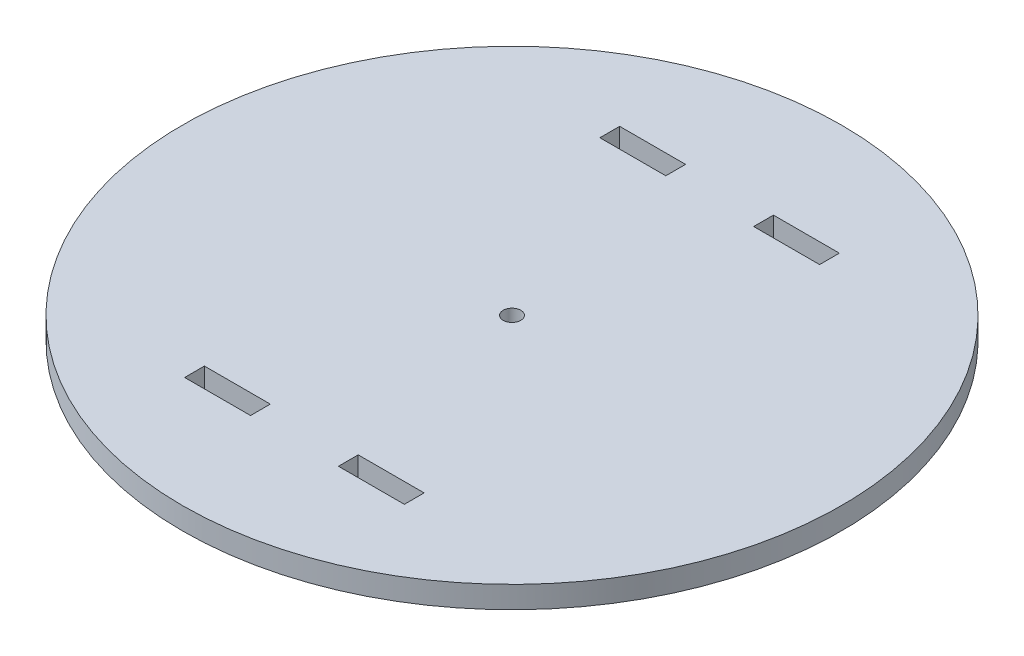
ISO-10303-21;
HEADER;
FILE_DESCRIPTION(('STEP AP214'),'2;1');
FILE_NAME('part.step','',(''),(''),'','','');
FILE_SCHEMA(('AUTOMOTIVE_DESIGN { 1 0 10303 214 1 1 1 1 }'));
ENDSEC;
DATA;
#1=APPLICATION_CONTEXT('core data for automotive mechanical design processes');
#2=APPLICATION_PROTOCOL_DEFINITION('international standard','automotive_design',2000,#1);
#3=PRODUCT_CONTEXT('',#1,'mechanical');
#4=PRODUCT('Part','Part','',(#3));
#5=PRODUCT_RELATED_PRODUCT_CATEGORY('part','',(#4));
#6=PRODUCT_DEFINITION_FORMATION('','',#4);
#7=PRODUCT_DEFINITION_CONTEXT('part definition',#1,'design');
#8=PRODUCT_DEFINITION('design','',#6,#7);
#9=PRODUCT_DEFINITION_SHAPE('','',#8);
#10=(LENGTH_UNIT() NAMED_UNIT(*) SI_UNIT(.MILLI.,.METRE.));
#11=(NAMED_UNIT(*) PLANE_ANGLE_UNIT() SI_UNIT($,.RADIAN.));
#12=(NAMED_UNIT(*) SI_UNIT($,.STERADIAN.) SOLID_ANGLE_UNIT());
#13=UNCERTAINTY_MEASURE_WITH_UNIT(LENGTH_MEASURE(1.E-05),#10,'distance_accuracy_value','');
#14=(GEOMETRIC_REPRESENTATION_CONTEXT(3) GLOBAL_UNCERTAINTY_ASSIGNED_CONTEXT((#13)) GLOBAL_UNIT_ASSIGNED_CONTEXT((#10,
#11,#12)) REPRESENTATION_CONTEXT('',''));
#15=CARTESIAN_POINT('',(0.,0.,0.));
#16=DIRECTION('',(0.,0.,1.));
#17=DIRECTION('',(1.,0.,0.));
#18=AXIS2_PLACEMENT_3D('',#15,#16,#17);
#19=CARTESIAN_POINT('',(0.,5.,0.));
#20=DIRECTION('',(0.,1.,0.));
#21=DIRECTION('',(0.,0.,1.));
#22=AXIS2_PLACEMENT_3D('',#19,#20,#21);
#23=PLANE('',#22);
#24=CARTESIAN_POINT('',(0.,5.,0.));
#25=DIRECTION('',(0.,1.,0.));
#26=DIRECTION('',(0.,0.,1.));
#27=AXIS2_PLACEMENT_3D('',#24,#25,#26);
#28=CIRCLE('',#27,2.);
#29=CARTESIAN_POINT('',(0.,5.,2.));
#30=VERTEX_POINT('',#29);
#31=EDGE_CURVE('E286',#30,#30,#28,.T.);
#32=ORIENTED_EDGE('',*,*,#31,.F.);
#33=EDGE_LOOP('',(#32));
#34=FACE_BOUND('',#33,.T.);
#35=DIRECTION('',(1.,0.,0.));
#36=VECTOR('',#35,1.);
#37=CARTESIAN_POINT('',(0.,5.,49.5));
#38=LINE('',#37,#36);
#39=CARTESIAN_POINT('',(10.,5.,49.5));
#40=VERTEX_POINT('',#39);
#41=CARTESIAN_POINT('',(25.,5.,49.5));
#42=VERTEX_POINT('',#41);
#43=EDGE_CURVE('E57',#40,#42,#38,.T.);
#44=ORIENTED_EDGE('',*,*,#43,.F.);
#45=DIRECTION('',(0.,0.,-1.));
#46=VECTOR('',#45,1.);
#47=CARTESIAN_POINT('',(10.,5.,0.));
#48=LINE('',#47,#46);
#49=CARTESIAN_POINT('',(10.,5.,45.));
#50=VERTEX_POINT('',#49);
#51=EDGE_CURVE('E185',#40,#50,#48,.T.);
#52=ORIENTED_EDGE('',*,*,#51,.T.);
#53=DIRECTION('',(1.,0.,0.));
#54=VECTOR('',#53,1.);
#55=CARTESIAN_POINT('',(0.,5.,45.));
#56=LINE('',#55,#54);
#57=CARTESIAN_POINT('',(25.,5.,45.));
#58=VERTEX_POINT('',#57);
#59=EDGE_CURVE('E182',#50,#58,#56,.T.);
#60=ORIENTED_EDGE('',*,*,#59,.T.);
#61=DIRECTION('',(0.,0.,-1.));
#62=VECTOR('',#61,1.);
#63=CARTESIAN_POINT('',(25.,5.,0.));
#64=LINE('',#63,#62);
#65=EDGE_CURVE('E179',#42,#58,#64,.T.);
#66=ORIENTED_EDGE('',*,*,#65,.F.);
#67=EDGE_LOOP('',(#44,#52,#60,#66));
#68=FACE_BOUND('',#67,.T.);
#69=DIRECTION('',(0.,0.,1.));
#70=VECTOR('',#69,1.);
#71=CARTESIAN_POINT('',(-25.,5.,0.));
#72=LINE('',#71,#70);
#73=CARTESIAN_POINT('',(-25.,5.,-49.5));
#74=VERTEX_POINT('',#73);
#75=CARTESIAN_POINT('',(-25.,5.,-45.));
#76=VERTEX_POINT('',#75);
#77=EDGE_CURVE('E196',#74,#76,#72,.T.);
#78=ORIENTED_EDGE('',*,*,#77,.F.);
#79=DIRECTION('',(1.,0.,0.));
#80=VECTOR('',#79,1.);
#81=CARTESIAN_POINT('',(0.,5.,-49.5));
#82=LINE('',#81,#80);
#83=CARTESIAN_POINT('',(-10.,5.,-49.5));
#84=VERTEX_POINT('',#83);
#85=EDGE_CURVE('E205',#74,#84,#82,.T.);
#86=ORIENTED_EDGE('',*,*,#85,.T.);
#87=DIRECTION('',(0.,0.,1.));
#88=VECTOR('',#87,1.);
#89=CARTESIAN_POINT('',(-10.,5.,0.));
#90=LINE('',#89,#88);
#91=CARTESIAN_POINT('',(-10.,5.,-45.));
#92=VERTEX_POINT('',#91);
#93=EDGE_CURVE('E202',#84,#92,#90,.T.);
#94=ORIENTED_EDGE('',*,*,#93,.T.);
#95=DIRECTION('',(1.,0.,0.));
#96=VECTOR('',#95,1.);
#97=CARTESIAN_POINT('',(0.,5.,-45.));
#98=LINE('',#97,#96);
#99=EDGE_CURVE('E198',#76,#92,#98,.T.);
#100=ORIENTED_EDGE('',*,*,#99,.F.);
#101=EDGE_LOOP('',(#78,#86,#94,#100));
#102=FACE_BOUND('',#101,.T.);
#103=CARTESIAN_POINT('',(0.,5.,0.));
#104=DIRECTION('',(0.,1.,0.));
#105=DIRECTION('',(0.,0.,1.));
#106=AXIS2_PLACEMENT_3D('',#103,#104,#105);
#107=CIRCLE('',#106,75.);
#108=CARTESIAN_POINT('',(0.,5.,75.));
#109=VERTEX_POINT('',#108);
#110=EDGE_CURVE('E237',#109,#109,#107,.T.);
#111=ORIENTED_EDGE('',*,*,#110,.T.);
#112=EDGE_LOOP('',(#111));
#113=FACE_BOUND('',#112,.T.);
#114=DIRECTION('',(0.,0.,1.));
#115=VECTOR('',#114,1.);
#116=CARTESIAN_POINT('',(10.,5.,0.));
#117=LINE('',#116,#115);
#118=CARTESIAN_POINT('',(10.,5.,-49.5));
#119=VERTEX_POINT('',#118);
#120=CARTESIAN_POINT('',(10.,5.,-45.));
#121=VERTEX_POINT('',#120);
#122=EDGE_CURVE('E220',#119,#121,#117,.T.);
#123=ORIENTED_EDGE('',*,*,#122,.F.);
#124=DIRECTION('',(1.,0.,0.));
#125=VECTOR('',#124,1.);
#126=CARTESIAN_POINT('',(0.,5.,-49.5));
#127=LINE('',#126,#125);
#128=CARTESIAN_POINT('',(25.,5.,-49.5));
#129=VERTEX_POINT('',#128);
#130=EDGE_CURVE('E175',#119,#129,#127,.T.);
#131=ORIENTED_EDGE('',*,*,#130,.T.);
#132=DIRECTION('',(0.,0.,1.));
#133=VECTOR('',#132,1.);
#134=CARTESIAN_POINT('',(25.,5.,0.));
#135=LINE('',#134,#133);
#136=CARTESIAN_POINT('',(25.,5.,-45.));
#137=VERTEX_POINT('',#136);
#138=EDGE_CURVE('E226',#129,#137,#135,.T.);
#139=ORIENTED_EDGE('',*,*,#138,.T.);
#140=DIRECTION('',(1.,0.,0.));
#141=VECTOR('',#140,1.);
#142=CARTESIAN_POINT('',(0.,5.,-45.));
#143=LINE('',#142,#141);
#144=EDGE_CURVE('E223',#121,#137,#143,.T.);
#145=ORIENTED_EDGE('',*,*,#144,.F.);
#146=EDGE_LOOP('',(#123,#131,#139,#145));
#147=FACE_BOUND('',#146,.T.);
#148=DIRECTION('',(1.,0.,0.));
#149=VECTOR('',#148,1.);
#150=CARTESIAN_POINT('',(0.,5.,49.5));
#151=LINE('',#150,#149);
#152=CARTESIAN_POINT('',(-25.,5.,49.5));
#153=VERTEX_POINT('',#152);
#154=CARTESIAN_POINT('',(-10.,5.,49.5));
#155=VERTEX_POINT('',#154);
#156=EDGE_CURVE('E163',#153,#155,#151,.T.);
#157=ORIENTED_EDGE('',*,*,#156,.F.);
#158=DIRECTION('',(0.,0.,-1.));
#159=VECTOR('',#158,1.);
#160=CARTESIAN_POINT('',(-25.,5.,0.));
#161=LINE('',#160,#159);
#162=CARTESIAN_POINT('',(-25.,5.,45.));
#163=VERTEX_POINT('',#162);
#164=EDGE_CURVE('E49',#153,#163,#161,.T.);
#165=ORIENTED_EDGE('',*,*,#164,.T.);
#166=DIRECTION('',(1.,0.,0.));
#167=VECTOR('',#166,1.);
#168=CARTESIAN_POINT('',(0.,5.,45.));
#169=LINE('',#168,#167);
#170=CARTESIAN_POINT('',(-10.,5.,45.));
#171=VERTEX_POINT('',#170);
#172=EDGE_CURVE('E168',#163,#171,#169,.T.);
#173=ORIENTED_EDGE('',*,*,#172,.T.);
#174=DIRECTION('',(0.,0.,-1.));
#175=VECTOR('',#174,1.);
#176=CARTESIAN_POINT('',(-10.,5.,0.));
#177=LINE('',#176,#175);
#178=EDGE_CURVE('E153',#155,#171,#177,.T.);
#179=ORIENTED_EDGE('',*,*,#178,.F.);
#180=EDGE_LOOP('',(#157,#165,#173,#179));
#181=FACE_BOUND('',#180,.T.);
#182=ADVANCED_FACE('F33',(#34,#68,#102,#113,#147,#181),#23,.T.);
#183=CARTESIAN_POINT('',(0.,0.,0.));
#184=DIRECTION('',(0.,1.,0.));
#185=DIRECTION('',(0.,0.,1.));
#186=AXIS2_PLACEMENT_3D('',#183,#184,#185);
#187=PLANE('',#186);
#188=CARTESIAN_POINT('',(0.,0.,0.));
#189=DIRECTION('',(0.,1.,0.));
#190=DIRECTION('',(0.,0.,1.));
#191=AXIS2_PLACEMENT_3D('',#188,#189,#190);
#192=CIRCLE('',#191,2.);
#193=CARTESIAN_POINT('',(0.,0.,2.));
#194=VERTEX_POINT('',#193);
#195=EDGE_CURVE('E37',#194,#194,#192,.T.);
#196=ORIENTED_EDGE('',*,*,#195,.T.);
#197=EDGE_LOOP('',(#196));
#198=FACE_BOUND('',#197,.T.);
#199=DIRECTION('',(1.,0.,0.));
#200=VECTOR('',#199,1.);
#201=CARTESIAN_POINT('',(0.,0.,-49.5));
#202=LINE('',#201,#200);
#203=CARTESIAN_POINT('',(10.,0.,-49.5));
#204=VERTEX_POINT('',#203);
#205=CARTESIAN_POINT('',(25.,0.,-49.5));
#206=VERTEX_POINT('',#205);
#207=EDGE_CURVE('E250',#204,#206,#202,.T.);
#208=ORIENTED_EDGE('',*,*,#207,.F.);
#209=DIRECTION('',(0.,0.,1.));
#210=VECTOR('',#209,1.);
#211=CARTESIAN_POINT('',(10.,0.,0.));
#212=LINE('',#211,#210);
#213=CARTESIAN_POINT('',(10.,0.,-45.));
#214=VERTEX_POINT('',#213);
#215=EDGE_CURVE('E240',#204,#214,#212,.T.);
#216=ORIENTED_EDGE('',*,*,#215,.T.);
#217=DIRECTION('',(1.,0.,0.));
#218=VECTOR('',#217,1.);
#219=CARTESIAN_POINT('',(0.,0.,-45.));
#220=LINE('',#219,#218);
#221=CARTESIAN_POINT('',(25.,0.,-45.));
#222=VERTEX_POINT('',#221);
#223=EDGE_CURVE('E245',#214,#222,#220,.T.);
#224=ORIENTED_EDGE('',*,*,#223,.T.);
#225=DIRECTION('',(0.,0.,1.));
#226=VECTOR('',#225,1.);
#227=CARTESIAN_POINT('',(25.,0.,0.));
#228=LINE('',#227,#226);
#229=EDGE_CURVE('E248',#206,#222,#228,.T.);
#230=ORIENTED_EDGE('',*,*,#229,.F.);
#231=EDGE_LOOP('',(#208,#216,#224,#230));
#232=FACE_BOUND('',#231,.T.);
#233=CARTESIAN_POINT('',(0.,0.,0.));
#234=DIRECTION('',(0.,1.,0.));
#235=DIRECTION('',(0.,0.,1.));
#236=AXIS2_PLACEMENT_3D('',#233,#234,#235);
#237=CIRCLE('',#236,75.);
#238=CARTESIAN_POINT('',(0.,0.,75.));
#239=VERTEX_POINT('',#238);
#240=EDGE_CURVE('E211',#239,#239,#237,.T.);
#241=ORIENTED_EDGE('',*,*,#240,.F.);
#242=EDGE_LOOP('',(#241));
#243=FACE_BOUND('',#242,.T.);
#244=DIRECTION('',(1.,0.,0.));
#245=VECTOR('',#244,1.);
#246=CARTESIAN_POINT('',(0.,0.,-49.5));
#247=LINE('',#246,#245);
#248=CARTESIAN_POINT('',(-25.,0.,-49.5));
#249=VERTEX_POINT('',#248);
#250=CARTESIAN_POINT('',(-10.,0.,-49.5));
#251=VERTEX_POINT('',#250);
#252=EDGE_CURVE('E258',#249,#251,#247,.T.);
#253=ORIENTED_EDGE('',*,*,#252,.F.);
#254=DIRECTION('',(0.,0.,1.));
#255=VECTOR('',#254,1.);
#256=CARTESIAN_POINT('',(-25.,0.,0.));
#257=LINE('',#256,#255);
#258=CARTESIAN_POINT('',(-25.,0.,-45.));
#259=VERTEX_POINT('',#258);
#260=EDGE_CURVE('E260',#249,#259,#257,.T.);
#261=ORIENTED_EDGE('',*,*,#260,.T.);
#262=DIRECTION('',(1.,0.,0.));
#263=VECTOR('',#262,1.);
#264=CARTESIAN_POINT('',(0.,0.,-45.));
#265=LINE('',#264,#263);
#266=CARTESIAN_POINT('',(-10.,0.,-45.));
#267=VERTEX_POINT('',#266);
#268=EDGE_CURVE('E252',#259,#267,#265,.T.);
#269=ORIENTED_EDGE('',*,*,#268,.T.);
#270=DIRECTION('',(0.,0.,1.));
#271=VECTOR('',#270,1.);
#272=CARTESIAN_POINT('',(-10.,0.,0.));
#273=LINE('',#272,#271);
#274=EDGE_CURVE('E255',#251,#267,#273,.T.);
#275=ORIENTED_EDGE('',*,*,#274,.F.);
#276=EDGE_LOOP('',(#253,#261,#269,#275));
#277=FACE_BOUND('',#276,.T.);
#278=DIRECTION('',(0.,0.,-1.));
#279=VECTOR('',#278,1.);
#280=CARTESIAN_POINT('',(10.,0.,0.));
#281=LINE('',#280,#279);
#282=CARTESIAN_POINT('',(10.,0.,49.5));
#283=VERTEX_POINT('',#282);
#284=CARTESIAN_POINT('',(10.,0.,45.));
#285=VERTEX_POINT('',#284);
#286=EDGE_CURVE('E269',#283,#285,#281,.T.);
#287=ORIENTED_EDGE('',*,*,#286,.F.);
#288=DIRECTION('',(1.,0.,0.));
#289=VECTOR('',#288,1.);
#290=CARTESIAN_POINT('',(0.,0.,49.5));
#291=LINE('',#290,#289);
#292=CARTESIAN_POINT('',(25.,0.,49.5));
#293=VERTEX_POINT('',#292);
#294=EDGE_CURVE('E271',#283,#293,#291,.T.);
#295=ORIENTED_EDGE('',*,*,#294,.T.);
#296=DIRECTION('',(0.,0.,-1.));
#297=VECTOR('',#296,1.);
#298=CARTESIAN_POINT('',(25.,0.,0.));
#299=LINE('',#298,#297);
#300=CARTESIAN_POINT('',(25.,0.,45.));
#301=VERTEX_POINT('',#300);
#302=EDGE_CURVE('E263',#293,#301,#299,.T.);
#303=ORIENTED_EDGE('',*,*,#302,.T.);
#304=DIRECTION('',(1.,0.,0.));
#305=VECTOR('',#304,1.);
#306=CARTESIAN_POINT('',(0.,0.,45.));
#307=LINE('',#306,#305);
#308=EDGE_CURVE('E266',#285,#301,#307,.T.);
#309=ORIENTED_EDGE('',*,*,#308,.F.);
#310=EDGE_LOOP('',(#287,#295,#303,#309));
#311=FACE_BOUND('',#310,.T.);
#312=DIRECTION('',(0.,0.,-1.));
#313=VECTOR('',#312,1.);
#314=CARTESIAN_POINT('',(-25.,0.,0.));
#315=LINE('',#314,#313);
#316=CARTESIAN_POINT('',(-25.,0.,49.5));
#317=VERTEX_POINT('',#316);
#318=CARTESIAN_POINT('',(-25.,0.,45.));
#319=VERTEX_POINT('',#318);
#320=EDGE_CURVE('E11',#317,#319,#315,.T.);
#321=ORIENTED_EDGE('',*,*,#320,.F.);
#322=DIRECTION('',(1.,0.,0.));
#323=VECTOR('',#322,1.);
#324=CARTESIAN_POINT('',(0.,0.,49.5));
#325=LINE('',#324,#323);
#326=CARTESIAN_POINT('',(-10.,0.,49.5));
#327=VERTEX_POINT('',#326);
#328=EDGE_CURVE('E274',#317,#327,#325,.T.);
#329=ORIENTED_EDGE('',*,*,#328,.T.);
#330=DIRECTION('',(0.,0.,-1.));
#331=VECTOR('',#330,1.);
#332=CARTESIAN_POINT('',(-10.,0.,0.));
#333=LINE('',#332,#331);
#334=CARTESIAN_POINT('',(-10.,0.,45.));
#335=VERTEX_POINT('',#334);
#336=EDGE_CURVE('E156',#327,#335,#333,.T.);
#337=ORIENTED_EDGE('',*,*,#336,.T.);
#338=DIRECTION('',(1.,0.,0.));
#339=VECTOR('',#338,1.);
#340=CARTESIAN_POINT('',(0.,0.,45.));
#341=LINE('',#340,#339);
#342=EDGE_CURVE('E42',#319,#335,#341,.T.);
#343=ORIENTED_EDGE('',*,*,#342,.F.);
#344=EDGE_LOOP('',(#321,#329,#337,#343));
#345=FACE_BOUND('',#344,.T.);
#346=ADVANCED_FACE('F283',(#198,#232,#243,#277,#311,#345),#187,.F.);
#347=CARTESIAN_POINT('',(0.,5.,0.));
#348=DIRECTION('',(0.,-1.,0.));
#349=DIRECTION('',(0.,0.,-1.));
#350=AXIS2_PLACEMENT_3D('',#347,#348,#349);
#351=CYLINDRICAL_SURFACE('',#350,75.);
#352=ORIENTED_EDGE('',*,*,#110,.F.);
#353=EDGE_LOOP('',(#352));
#354=FACE_BOUND('',#353,.T.);
#355=ORIENTED_EDGE('',*,*,#240,.T.);
#356=EDGE_LOOP('',(#355));
#357=FACE_BOUND('',#356,.T.);
#358=ADVANCED_FACE('F35',(#354,#357),#351,.T.);
#359=CARTESIAN_POINT('',(0.,-5.,-49.5));
#360=DIRECTION('',(0.,0.,1.));
#361=DIRECTION('',(1.,0.,0.));
#362=AXIS2_PLACEMENT_3D('',#359,#360,#361);
#363=PLANE('',#362);
#364=ORIENTED_EDGE('',*,*,#207,.T.);
#365=DIRECTION('',(0.,1.,0.));
#366=VECTOR('',#365,1.);
#367=CARTESIAN_POINT('',(25.,-5.,-49.5));
#368=LINE('',#367,#366);
#369=EDGE_CURVE('E199',#206,#129,#368,.T.);
#370=ORIENTED_EDGE('',*,*,#369,.T.);
#371=ORIENTED_EDGE('',*,*,#130,.F.);
#372=DIRECTION('',(0.,1.,0.));
#373=VECTOR('',#372,1.);
#374=CARTESIAN_POINT('',(10.,-5.,-49.5));
#375=LINE('',#374,#373);
#376=EDGE_CURVE('E229',#204,#119,#375,.T.);
#377=ORIENTED_EDGE('',*,*,#376,.F.);
#378=EDGE_LOOP('',(#364,#370,#371,#377));
#379=FACE_BOUND('',#378,.T.);
#380=ADVANCED_FACE('F312',(#379),#363,.T.);
#381=CARTESIAN_POINT('',(25.,-5.,0.));
#382=DIRECTION('',(-1.,0.,0.));
#383=DIRECTION('',(0.,0.,1.));
#384=AXIS2_PLACEMENT_3D('',#381,#382,#383);
#385=PLANE('',#384);
#386=ORIENTED_EDGE('',*,*,#229,.T.);
#387=DIRECTION('',(0.,1.,0.));
#388=VECTOR('',#387,1.);
#389=CARTESIAN_POINT('',(25.,-5.,-45.));
#390=LINE('',#389,#388);
#391=EDGE_CURVE('E231',#222,#137,#390,.T.);
#392=ORIENTED_EDGE('',*,*,#391,.T.);
#393=ORIENTED_EDGE('',*,*,#138,.F.);
#394=ORIENTED_EDGE('',*,*,#369,.F.);
#395=EDGE_LOOP('',(#386,#392,#393,#394));
#396=FACE_BOUND('',#395,.T.);
#397=ADVANCED_FACE('F315',(#396),#385,.T.);
#398=CARTESIAN_POINT('',(0.,-5.,-45.));
#399=DIRECTION('',(0.,0.,1.));
#400=DIRECTION('',(1.,0.,0.));
#401=AXIS2_PLACEMENT_3D('',#398,#399,#400);
#402=PLANE('',#401);
#403=DIRECTION('',(0.,1.,0.));
#404=VECTOR('',#403,1.);
#405=CARTESIAN_POINT('',(10.,-5.,-45.));
#406=LINE('',#405,#404);
#407=EDGE_CURVE('E233',#214,#121,#406,.T.);
#408=ORIENTED_EDGE('',*,*,#407,.T.);
#409=ORIENTED_EDGE('',*,*,#144,.T.);
#410=ORIENTED_EDGE('',*,*,#391,.F.);
#411=ORIENTED_EDGE('',*,*,#223,.F.);
#412=EDGE_LOOP('',(#408,#409,#410,#411));
#413=FACE_BOUND('',#412,.T.);
#414=ADVANCED_FACE('F321',(#413),#402,.F.);
#415=CARTESIAN_POINT('',(10.,-5.,0.));
#416=DIRECTION('',(-1.,0.,0.));
#417=DIRECTION('',(0.,0.,1.));
#418=AXIS2_PLACEMENT_3D('',#415,#416,#417);
#419=PLANE('',#418);
#420=ORIENTED_EDGE('',*,*,#376,.T.);
#421=ORIENTED_EDGE('',*,*,#122,.T.);
#422=ORIENTED_EDGE('',*,*,#407,.F.);
#423=ORIENTED_EDGE('',*,*,#215,.F.);
#424=EDGE_LOOP('',(#420,#421,#422,#423));
#425=FACE_BOUND('',#424,.T.);
#426=ADVANCED_FACE('F317',(#425),#419,.F.);
#427=CARTESIAN_POINT('',(-25.,-5.,0.));
#428=DIRECTION('',(-1.,0.,0.));
#429=DIRECTION('',(0.,0.,1.));
#430=AXIS2_PLACEMENT_3D('',#427,#428,#429);
#431=PLANE('',#430);
#432=DIRECTION('',(0.,1.,0.));
#433=VECTOR('',#432,1.);
#434=CARTESIAN_POINT('',(-25.,-5.,-49.5));
#435=LINE('',#434,#433);
#436=EDGE_CURVE('E209',#249,#74,#435,.T.);
#437=ORIENTED_EDGE('',*,*,#436,.T.);
#438=ORIENTED_EDGE('',*,*,#77,.T.);
#439=DIRECTION('',(0.,1.,0.));
#440=VECTOR('',#439,1.);
#441=CARTESIAN_POINT('',(-25.,-5.,-45.));
#442=LINE('',#441,#440);
#443=EDGE_CURVE('E208',#259,#76,#442,.T.);
#444=ORIENTED_EDGE('',*,*,#443,.F.);
#445=ORIENTED_EDGE('',*,*,#260,.F.);
#446=EDGE_LOOP('',(#437,#438,#444,#445));
#447=FACE_BOUND('',#446,.T.);
#448=ADVANCED_FACE('F320',(#447),#431,.F.);
#449=CARTESIAN_POINT('',(0.,-5.,-49.5));
#450=DIRECTION('',(0.,0.,1.));
#451=DIRECTION('',(1.,0.,0.));
#452=AXIS2_PLACEMENT_3D('',#449,#450,#451);
#453=PLANE('',#452);
#454=ORIENTED_EDGE('',*,*,#252,.T.);
#455=DIRECTION('',(0.,1.,0.));
#456=VECTOR('',#455,1.);
#457=CARTESIAN_POINT('',(-10.,-5.,-49.5));
#458=LINE('',#457,#456);
#459=EDGE_CURVE('E212',#251,#84,#458,.T.);
#460=ORIENTED_EDGE('',*,*,#459,.T.);
#461=ORIENTED_EDGE('',*,*,#85,.F.);
#462=ORIENTED_EDGE('',*,*,#436,.F.);
#463=EDGE_LOOP('',(#454,#460,#461,#462));
#464=FACE_BOUND('',#463,.T.);
#465=ADVANCED_FACE('F331',(#464),#453,.T.);
#466=CARTESIAN_POINT('',(-10.,-5.,0.));
#467=DIRECTION('',(-1.,0.,0.));
#468=DIRECTION('',(0.,0.,1.));
#469=AXIS2_PLACEMENT_3D('',#466,#467,#468);
#470=PLANE('',#469);
#471=ORIENTED_EDGE('',*,*,#274,.T.);
#472=DIRECTION('',(0.,1.,0.));
#473=VECTOR('',#472,1.);
#474=CARTESIAN_POINT('',(-10.,-5.,-45.));
#475=LINE('',#474,#473);
#476=EDGE_CURVE('E214',#267,#92,#475,.T.);
#477=ORIENTED_EDGE('',*,*,#476,.T.);
#478=ORIENTED_EDGE('',*,*,#93,.F.);
#479=ORIENTED_EDGE('',*,*,#459,.F.);
#480=EDGE_LOOP('',(#471,#477,#478,#479));
#481=FACE_BOUND('',#480,.T.);
#482=ADVANCED_FACE('F337',(#481),#470,.T.);
#483=CARTESIAN_POINT('',(0.,-5.,-45.));
#484=DIRECTION('',(0.,0.,1.));
#485=DIRECTION('',(1.,0.,0.));
#486=AXIS2_PLACEMENT_3D('',#483,#484,#485);
#487=PLANE('',#486);
#488=ORIENTED_EDGE('',*,*,#443,.T.);
#489=ORIENTED_EDGE('',*,*,#99,.T.);
#490=ORIENTED_EDGE('',*,*,#476,.F.);
#491=ORIENTED_EDGE('',*,*,#268,.F.);
#492=EDGE_LOOP('',(#488,#489,#490,#491));
#493=FACE_BOUND('',#492,.T.);
#494=ADVANCED_FACE('F333',(#493),#487,.F.);
#495=CARTESIAN_POINT('',(0.,-5.,49.5));
#496=DIRECTION('',(0.,0.,1.));
#497=DIRECTION('',(1.,0.,0.));
#498=AXIS2_PLACEMENT_3D('',#495,#496,#497);
#499=PLANE('',#498);
#500=DIRECTION('',(0.,1.,0.));
#501=VECTOR('',#500,1.);
#502=CARTESIAN_POINT('',(10.,-5.,49.5));
#503=LINE('',#502,#501);
#504=EDGE_CURVE('E189',#283,#40,#503,.T.);
#505=ORIENTED_EDGE('',*,*,#504,.T.);
#506=ORIENTED_EDGE('',*,*,#43,.T.);
#507=DIRECTION('',(0.,1.,0.));
#508=VECTOR('',#507,1.);
#509=CARTESIAN_POINT('',(25.,-5.,49.5));
#510=LINE('',#509,#508);
#511=EDGE_CURVE('E188',#293,#42,#510,.T.);
#512=ORIENTED_EDGE('',*,*,#511,.F.);
#513=ORIENTED_EDGE('',*,*,#294,.F.);
#514=EDGE_LOOP('',(#505,#506,#512,#513));
#515=FACE_BOUND('',#514,.T.);
#516=ADVANCED_FACE('F336',(#515),#499,.F.);
#517=CARTESIAN_POINT('',(10.,-5.,0.));
#518=DIRECTION('',(1.,0.,0.));
#519=DIRECTION('',(0.,0.,-1.));
#520=AXIS2_PLACEMENT_3D('',#517,#518,#519);
#521=PLANE('',#520);
#522=ORIENTED_EDGE('',*,*,#286,.T.);
#523=DIRECTION('',(0.,1.,0.));
#524=VECTOR('',#523,1.);
#525=CARTESIAN_POINT('',(10.,-5.,45.));
#526=LINE('',#525,#524);
#527=EDGE_CURVE('E191',#285,#50,#526,.T.);
#528=ORIENTED_EDGE('',*,*,#527,.T.);
#529=ORIENTED_EDGE('',*,*,#51,.F.);
#530=ORIENTED_EDGE('',*,*,#504,.F.);
#531=EDGE_LOOP('',(#522,#528,#529,#530));
#532=FACE_BOUND('',#531,.T.);
#533=ADVANCED_FACE('F347',(#532),#521,.T.);
#534=CARTESIAN_POINT('',(0.,-5.,45.));
#535=DIRECTION('',(0.,0.,1.));
#536=DIRECTION('',(1.,0.,0.));
#537=AXIS2_PLACEMENT_3D('',#534,#535,#536);
#538=PLANE('',#537);
#539=ORIENTED_EDGE('',*,*,#308,.T.);
#540=DIRECTION('',(0.,1.,0.));
#541=VECTOR('',#540,1.);
#542=CARTESIAN_POINT('',(25.,-5.,45.));
#543=LINE('',#542,#541);
#544=EDGE_CURVE('E193',#301,#58,#543,.T.);
#545=ORIENTED_EDGE('',*,*,#544,.T.);
#546=ORIENTED_EDGE('',*,*,#59,.F.);
#547=ORIENTED_EDGE('',*,*,#527,.F.);
#548=EDGE_LOOP('',(#539,#545,#546,#547));
#549=FACE_BOUND('',#548,.T.);
#550=ADVANCED_FACE('F351',(#549),#538,.T.);
#551=CARTESIAN_POINT('',(25.,-5.,0.));
#552=DIRECTION('',(1.,0.,0.));
#553=DIRECTION('',(0.,0.,-1.));
#554=AXIS2_PLACEMENT_3D('',#551,#552,#553);
#555=PLANE('',#554);
#556=ORIENTED_EDGE('',*,*,#511,.T.);
#557=ORIENTED_EDGE('',*,*,#65,.T.);
#558=ORIENTED_EDGE('',*,*,#544,.F.);
#559=ORIENTED_EDGE('',*,*,#302,.F.);
#560=EDGE_LOOP('',(#556,#557,#558,#559));
#561=FACE_BOUND('',#560,.T.);
#562=ADVANCED_FACE('F348',(#561),#555,.F.);
#563=CARTESIAN_POINT('',(-25.,-5.,0.));
#564=DIRECTION('',(1.,0.,0.));
#565=DIRECTION('',(0.,0.,-1.));
#566=AXIS2_PLACEMENT_3D('',#563,#564,#565);
#567=PLANE('',#566);
#568=ORIENTED_EDGE('',*,*,#320,.T.);
#569=DIRECTION('',(0.,1.,0.));
#570=VECTOR('',#569,1.);
#571=CARTESIAN_POINT('',(-25.,-5.,45.));
#572=LINE('',#571,#570);
#573=EDGE_CURVE('E173',#319,#163,#572,.T.);
#574=ORIENTED_EDGE('',*,*,#573,.T.);
#575=ORIENTED_EDGE('',*,*,#164,.F.);
#576=DIRECTION('',(0.,1.,0.));
#577=VECTOR('',#576,1.);
#578=CARTESIAN_POINT('',(-25.,-5.,49.5));
#579=LINE('',#578,#577);
#580=EDGE_CURVE('E160',#317,#153,#579,.T.);
#581=ORIENTED_EDGE('',*,*,#580,.F.);
#582=EDGE_LOOP('',(#568,#574,#575,#581));
#583=FACE_BOUND('',#582,.T.);
#584=ADVANCED_FACE('F284',(#583),#567,.T.);
#585=CARTESIAN_POINT('',(0.,-5.,45.));
#586=DIRECTION('',(0.,0.,1.));
#587=DIRECTION('',(1.,0.,0.));
#588=AXIS2_PLACEMENT_3D('',#585,#586,#587);
#589=PLANE('',#588);
#590=ORIENTED_EDGE('',*,*,#342,.T.);
#591=DIRECTION('',(0.,1.,0.));
#592=VECTOR('',#591,1.);
#593=CARTESIAN_POINT('',(-10.,-5.,45.));
#594=LINE('',#593,#592);
#595=EDGE_CURVE('E159',#335,#171,#594,.T.);
#596=ORIENTED_EDGE('',*,*,#595,.T.);
#597=ORIENTED_EDGE('',*,*,#172,.F.);
#598=ORIENTED_EDGE('',*,*,#573,.F.);
#599=EDGE_LOOP('',(#590,#596,#597,#598));
#600=FACE_BOUND('',#599,.T.);
#601=ADVANCED_FACE('F280',(#600),#589,.T.);
#602=CARTESIAN_POINT('',(-10.,-5.,0.));
#603=DIRECTION('',(1.,0.,0.));
#604=DIRECTION('',(0.,0.,-1.));
#605=AXIS2_PLACEMENT_3D('',#602,#603,#604);
#606=PLANE('',#605);
#607=DIRECTION('',(0.,1.,0.));
#608=VECTOR('',#607,1.);
#609=CARTESIAN_POINT('',(-10.,-5.,49.5));
#610=LINE('',#609,#608);
#611=EDGE_CURVE('E148',#327,#155,#610,.T.);
#612=ORIENTED_EDGE('',*,*,#611,.T.);
#613=ORIENTED_EDGE('',*,*,#178,.T.);
#614=ORIENTED_EDGE('',*,*,#595,.F.);
#615=ORIENTED_EDGE('',*,*,#336,.F.);
#616=EDGE_LOOP('',(#612,#613,#614,#615));
#617=FACE_BOUND('',#616,.T.);
#618=ADVANCED_FACE('F150',(#617),#606,.F.);
#619=CARTESIAN_POINT('',(0.,-5.,49.5));
#620=DIRECTION('',(0.,0.,1.));
#621=DIRECTION('',(1.,0.,0.));
#622=AXIS2_PLACEMENT_3D('',#619,#620,#621);
#623=PLANE('',#622);
#624=ORIENTED_EDGE('',*,*,#580,.T.);
#625=ORIENTED_EDGE('',*,*,#156,.T.);
#626=ORIENTED_EDGE('',*,*,#611,.F.);
#627=ORIENTED_EDGE('',*,*,#328,.F.);
#628=EDGE_LOOP('',(#624,#625,#626,#627));
#629=FACE_BOUND('',#628,.T.);
#630=ADVANCED_FACE('F164',(#629),#623,.F.);
#631=CARTESIAN_POINT('',(0.,-5.,0.));
#632=DIRECTION('',(0.,1.,0.));
#633=DIRECTION('',(0.,0.,1.));
#634=AXIS2_PLACEMENT_3D('',#631,#632,#633);
#635=CYLINDRICAL_SURFACE('',#634,2.);
#636=ORIENTED_EDGE('',*,*,#31,.T.);
#637=EDGE_LOOP('',(#636));
#638=FACE_BOUND('',#637,.T.);
#639=ORIENTED_EDGE('',*,*,#195,.F.);
#640=EDGE_LOOP('',(#639));
#641=FACE_BOUND('',#640,.T.);
#642=ADVANCED_FACE('F295',(#638,#641),#635,.F.);
#643=CLOSED_SHELL('',(#182,#346,#358,#380,#397,#414,#426,#448,#465,#482,#494,#516,#533,#550,
#562,#584,#601,#618,#630,#642));
#644=MANIFOLD_SOLID_BREP('B2',#643);
#645=ADVANCED_BREP_SHAPE_REPRESENTATION('',(#18,#644),#14);
#646=SHAPE_DEFINITION_REPRESENTATION(#9,#645);
ENDSEC;
END-ISO-10303-21;
